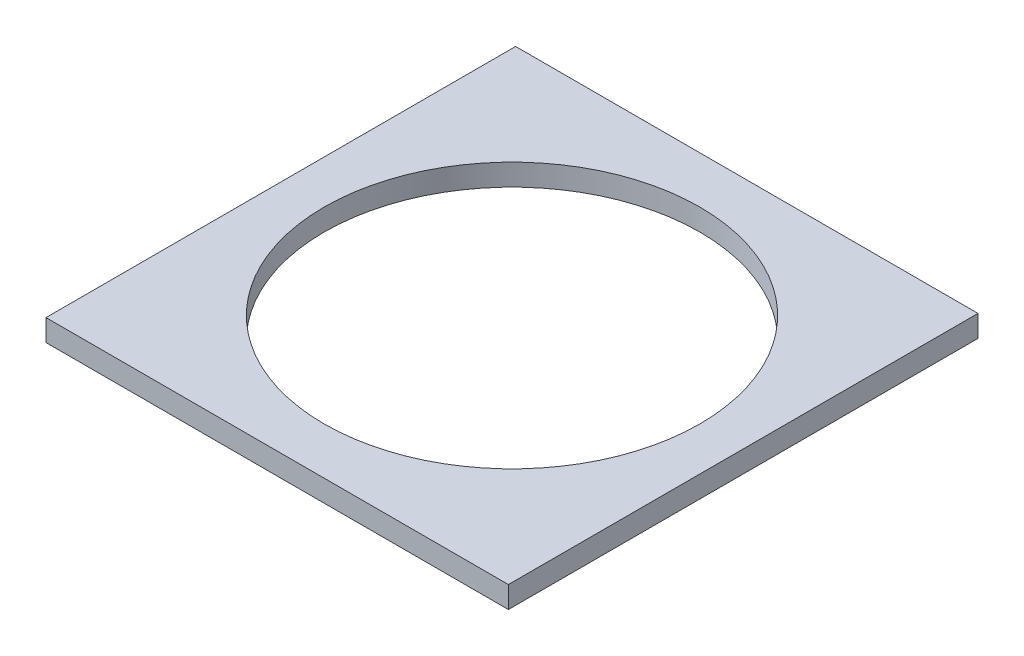
ISO-10303-21;
HEADER;
FILE_DESCRIPTION(('STEP AP214'),'2;1');
FILE_NAME('part.step','',(''),(''),'','','');
FILE_SCHEMA(('AUTOMOTIVE_DESIGN { 1 0 10303 214 1 1 1 1 }'));
ENDSEC;
DATA;
#1=APPLICATION_CONTEXT('core data for automotive mechanical design processes');
#2=APPLICATION_PROTOCOL_DEFINITION('international standard','automotive_design',2000,#1);
#3=PRODUCT_CONTEXT('',#1,'mechanical');
#4=PRODUCT('Part','Part','',(#3));
#5=PRODUCT_RELATED_PRODUCT_CATEGORY('part','',(#4));
#6=PRODUCT_DEFINITION_FORMATION('','',#4);
#7=PRODUCT_DEFINITION_CONTEXT('part definition',#1,'design');
#8=PRODUCT_DEFINITION('design','',#6,#7);
#9=PRODUCT_DEFINITION_SHAPE('','',#8);
#10=(LENGTH_UNIT() NAMED_UNIT(*) SI_UNIT(.MILLI.,.METRE.));
#11=(NAMED_UNIT(*) PLANE_ANGLE_UNIT() SI_UNIT($,.RADIAN.));
#12=(NAMED_UNIT(*) SI_UNIT($,.STERADIAN.) SOLID_ANGLE_UNIT());
#13=UNCERTAINTY_MEASURE_WITH_UNIT(LENGTH_MEASURE(1.E-05),#10,'distance_accuracy_value','');
#14=(GEOMETRIC_REPRESENTATION_CONTEXT(3) GLOBAL_UNCERTAINTY_ASSIGNED_CONTEXT((#13)) GLOBAL_UNIT_ASSIGNED_CONTEXT((#10,
#11,#12)) REPRESENTATION_CONTEXT('',''));
#15=CARTESIAN_POINT('',(0.,0.,0.));
#16=DIRECTION('',(0.,0.,1.));
#17=DIRECTION('',(1.,0.,0.));
#18=AXIS2_PLACEMENT_3D('',#15,#16,#17);
#19=CARTESIAN_POINT('',(0.,3.,0.));
#20=DIRECTION('',(0.,1.,0.));
#21=DIRECTION('',(0.,0.,1.));
#22=AXIS2_PLACEMENT_3D('',#19,#20,#21);
#23=PLANE('',#22);
#24=DIRECTION('',(0.,0.,1.));
#25=VECTOR('',#24,1.);
#26=CARTESIAN_POINT('',(-58.6759231077296,3.,-34.3128176738741));
#27=LINE('',#26,#25);
#28=CARTESIAN_POINT('',(-58.6759231077296,3.,-34.3128176738741));
#29=VERTEX_POINT('',#28);
#30=CARTESIAN_POINT('',(-58.6759231077296,3.,30.6871822907297));
#31=VERTEX_POINT('',#30);
#32=EDGE_CURVE('E93',#29,#31,#27,.T.);
#33=ORIENTED_EDGE('',*,*,#32,.T.);
#34=DIRECTION('',(1.,0.,0.));
#35=VECTOR('',#34,1.);
#36=CARTESIAN_POINT('',(-58.6759231077296,3.,30.6871822907297));
#37=LINE('',#36,#35);
#38=CARTESIAN_POINT('',(5.3240768922814,3.,30.6871822907297));
#39=VERTEX_POINT('',#38);
#40=EDGE_CURVE('E88',#31,#39,#37,.T.);
#41=ORIENTED_EDGE('',*,*,#40,.T.);
#42=DIRECTION('',(0.,0.,-1.));
#43=VECTOR('',#42,1.);
#44=CARTESIAN_POINT('',(5.3240768922814,3.,30.6871822907297));
#45=LINE('',#44,#43);
#46=CARTESIAN_POINT('',(5.3240768922814,3.,-34.3128176738741));
#47=VERTEX_POINT('',#46);
#48=EDGE_CURVE('E91',#39,#47,#45,.T.);
#49=ORIENTED_EDGE('',*,*,#48,.T.);
#50=DIRECTION('',(-1.,0.,0.));
#51=VECTOR('',#50,1.);
#52=CARTESIAN_POINT('',(5.3240768922814,3.,-34.3128176738741));
#53=LINE('',#52,#51);
#54=EDGE_CURVE('E58',#47,#29,#53,.T.);
#55=ORIENTED_EDGE('',*,*,#54,.T.);
#56=EDGE_LOOP('',(#33,#41,#49,#55));
#57=FACE_BOUND('',#56,.T.);
#58=CARTESIAN_POINT('',(-26.6759231076823,3.,-1.81281756190771));
#59=DIRECTION('',(0.,1.,0.));
#60=DIRECTION('',(0.,0.,1.));
#61=AXIS2_PLACEMENT_3D('',#58,#59,#60);
#62=CIRCLE('',#61,26.0000000000001);
#63=CARTESIAN_POINT('',(-26.6759231076823,3.,24.1871824380924));
#64=VERTEX_POINT('',#63);
#65=EDGE_CURVE('E108',#64,#64,#62,.T.);
#66=ORIENTED_EDGE('',*,*,#65,.F.);
#67=EDGE_LOOP('',(#66));
#68=FACE_BOUND('',#67,.T.);
#69=ADVANCED_FACE('F41',(#57,#68),#23,.T.);
#70=CARTESIAN_POINT('',(0.,0.,0.));
#71=DIRECTION('',(0.,1.,0.));
#72=DIRECTION('',(0.,0.,1.));
#73=AXIS2_PLACEMENT_3D('',#70,#71,#72);
#74=PLANE('',#73);
#75=DIRECTION('',(0.,0.,1.));
#76=VECTOR('',#75,1.);
#77=CARTESIAN_POINT('',(-58.6759231077296,0.,-34.3128176738741));
#78=LINE('',#77,#76);
#79=CARTESIAN_POINT('',(-58.6759231077296,0.,-34.3128176738741));
#80=VERTEX_POINT('',#79);
#81=CARTESIAN_POINT('',(-58.6759231077296,0.,30.6871822907297));
#82=VERTEX_POINT('',#81);
#83=EDGE_CURVE('E105',#80,#82,#78,.T.);
#84=ORIENTED_EDGE('',*,*,#83,.F.);
#85=DIRECTION('',(-1.,0.,0.));
#86=VECTOR('',#85,1.);
#87=CARTESIAN_POINT('',(5.3240768922814,0.,-34.3128176738741));
#88=LINE('',#87,#86);
#89=CARTESIAN_POINT('',(5.3240768922814,0.,-34.3128176738741));
#90=VERTEX_POINT('',#89);
#91=EDGE_CURVE('E81',#90,#80,#88,.T.);
#92=ORIENTED_EDGE('',*,*,#91,.F.);
#93=DIRECTION('',(0.,0.,-1.));
#94=VECTOR('',#93,1.);
#95=CARTESIAN_POINT('',(5.3240768922814,0.,30.6871822907297));
#96=LINE('',#95,#94);
#97=CARTESIAN_POINT('',(5.3240768922814,0.,30.6871822907297));
#98=VERTEX_POINT('',#97);
#99=EDGE_CURVE('E75',#98,#90,#96,.T.);
#100=ORIENTED_EDGE('',*,*,#99,.F.);
#101=DIRECTION('',(1.,0.,0.));
#102=VECTOR('',#101,1.);
#103=CARTESIAN_POINT('',(-58.6759231077296,0.,30.6871822907297));
#104=LINE('',#103,#102);
#105=EDGE_CURVE('E97',#82,#98,#104,.T.);
#106=ORIENTED_EDGE('',*,*,#105,.F.);
#107=EDGE_LOOP('',(#84,#92,#100,#106));
#108=FACE_BOUND('',#107,.T.);
#109=CARTESIAN_POINT('',(-26.6759231076823,0.,-1.81281756190771));
#110=DIRECTION('',(0.,1.,0.));
#111=DIRECTION('',(0.,0.,1.));
#112=AXIS2_PLACEMENT_3D('',#109,#110,#111);
#113=CIRCLE('',#112,26.0000000000001);
#114=CARTESIAN_POINT('',(-26.6759231076823,0.,24.1871824380924));
#115=VERTEX_POINT('',#114);
#116=EDGE_CURVE('E120',#115,#115,#113,.T.);
#117=ORIENTED_EDGE('',*,*,#116,.T.);
#118=EDGE_LOOP('',(#117));
#119=FACE_BOUND('',#118,.T.);
#120=ADVANCED_FACE('F116',(#108,#119),#74,.F.);
#121=CARTESIAN_POINT('',(-58.6759231077296,3.,-34.3128176738741));
#122=DIRECTION('',(1.,0.,0.));
#123=DIRECTION('',(0.,0.,-1.));
#124=AXIS2_PLACEMENT_3D('',#121,#122,#123);
#125=PLANE('',#124);
#126=ORIENTED_EDGE('',*,*,#83,.T.);
#127=DIRECTION('',(0.,-1.,0.));
#128=VECTOR('',#127,1.);
#129=CARTESIAN_POINT('',(-58.6759231077296,3.,30.6871822907297));
#130=LINE('',#129,#128);
#131=EDGE_CURVE('E11',#31,#82,#130,.T.);
#132=ORIENTED_EDGE('',*,*,#131,.F.);
#133=ORIENTED_EDGE('',*,*,#32,.F.);
#134=DIRECTION('',(0.,-1.,0.));
#135=VECTOR('',#134,1.);
#136=CARTESIAN_POINT('',(-58.6759231077296,3.,-34.3128176738741));
#137=LINE('',#136,#135);
#138=EDGE_CURVE('E101',#29,#80,#137,.T.);
#139=ORIENTED_EDGE('',*,*,#138,.T.);
#140=EDGE_LOOP('',(#126,#132,#133,#139));
#141=FACE_BOUND('',#140,.T.);
#142=ADVANCED_FACE('F43',(#141),#125,.F.);
#143=CARTESIAN_POINT('',(-58.6759231077296,3.,30.6871822907297));
#144=DIRECTION('',(0.,0.,-1.));
#145=DIRECTION('',(-1.,0.,0.));
#146=AXIS2_PLACEMENT_3D('',#143,#144,#145);
#147=PLANE('',#146);
#148=ORIENTED_EDGE('',*,*,#105,.T.);
#149=DIRECTION('',(0.,-1.,0.));
#150=VECTOR('',#149,1.);
#151=CARTESIAN_POINT('',(5.3240768922814,3.,30.6871822907297));
#152=LINE('',#151,#150);
#153=EDGE_CURVE('E50',#39,#98,#152,.T.);
#154=ORIENTED_EDGE('',*,*,#153,.F.);
#155=ORIENTED_EDGE('',*,*,#40,.F.);
#156=ORIENTED_EDGE('',*,*,#131,.T.);
#157=EDGE_LOOP('',(#148,#154,#155,#156));
#158=FACE_BOUND('',#157,.T.);
#159=ADVANCED_FACE('F96',(#158),#147,.F.);
#160=CARTESIAN_POINT('',(5.3240768922814,3.,30.6871822907297));
#161=DIRECTION('',(-1.,0.,0.));
#162=DIRECTION('',(0.,0.,1.));
#163=AXIS2_PLACEMENT_3D('',#160,#161,#162);
#164=PLANE('',#163);
#165=ORIENTED_EDGE('',*,*,#99,.T.);
#166=DIRECTION('',(0.,-1.,0.));
#167=VECTOR('',#166,1.);
#168=CARTESIAN_POINT('',(5.3240768922814,3.,-34.3128176738741));
#169=LINE('',#168,#167);
#170=EDGE_CURVE('E98',#47,#90,#169,.T.);
#171=ORIENTED_EDGE('',*,*,#170,.F.);
#172=ORIENTED_EDGE('',*,*,#48,.F.);
#173=ORIENTED_EDGE('',*,*,#153,.T.);
#174=EDGE_LOOP('',(#165,#171,#172,#173));
#175=FACE_BOUND('',#174,.T.);
#176=ADVANCED_FACE('F99',(#175),#164,.F.);
#177=CARTESIAN_POINT('',(5.3240768922814,3.,-34.3128176738741));
#178=DIRECTION('',(0.,0.,1.));
#179=DIRECTION('',(1.,0.,0.));
#180=AXIS2_PLACEMENT_3D('',#177,#178,#179);
#181=PLANE('',#180);
#182=ORIENTED_EDGE('',*,*,#91,.T.);
#183=ORIENTED_EDGE('',*,*,#138,.F.);
#184=ORIENTED_EDGE('',*,*,#54,.F.);
#185=ORIENTED_EDGE('',*,*,#170,.T.);
#186=EDGE_LOOP('',(#182,#183,#184,#185));
#187=FACE_BOUND('',#186,.T.);
#188=ADVANCED_FACE('F113',(#187),#181,.F.);
#189=CARTESIAN_POINT('',(-26.6759231076823,3.,-1.81281756190771));
#190=DIRECTION('',(0.,-1.,0.));
#191=DIRECTION('',(0.,0.,-1.));
#192=AXIS2_PLACEMENT_3D('',#189,#190,#191);
#193=CYLINDRICAL_SURFACE('',#192,26.0000000000001);
#194=ORIENTED_EDGE('',*,*,#65,.T.);
#195=EDGE_LOOP('',(#194));
#196=FACE_BOUND('',#195,.T.);
#197=ORIENTED_EDGE('',*,*,#116,.F.);
#198=EDGE_LOOP('',(#197));
#199=FACE_BOUND('',#198,.T.);
#200=ADVANCED_FACE('F126',(#196,#199),#193,.F.);
#201=CLOSED_SHELL('',(#69,#120,#142,#159,#176,#188,#200));
#202=MANIFOLD_SOLID_BREP('B2',#201);
#203=ADVANCED_BREP_SHAPE_REPRESENTATION('',(#18,#202),#14);
#204=SHAPE_DEFINITION_REPRESENTATION(#9,#203);
ENDSEC;
END-ISO-10303-21;
